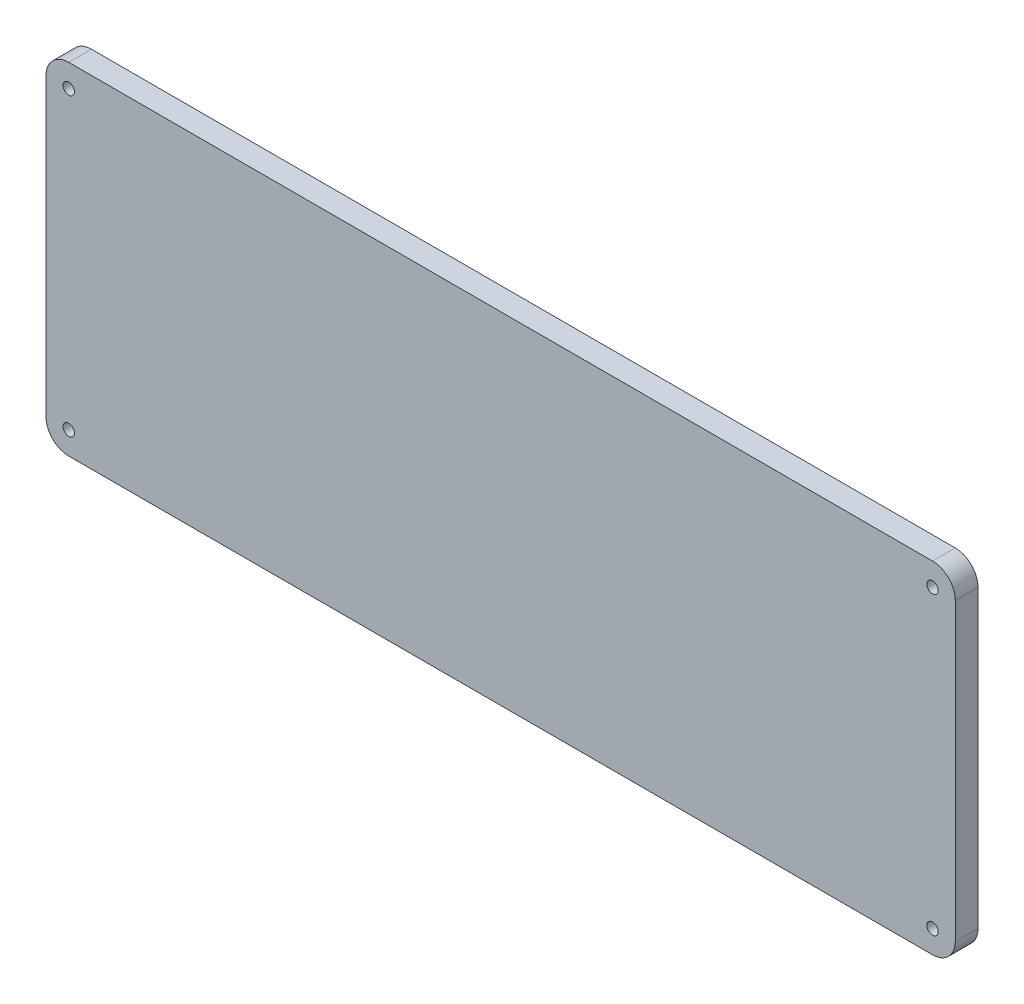
ISO-10303-21;
HEADER;
FILE_DESCRIPTION(('STEP AP214'),'2;1');
FILE_NAME('part.step','',(''),(''),'','','');
FILE_SCHEMA(('AUTOMOTIVE_DESIGN { 1 0 10303 214 1 1 1 1 }'));
ENDSEC;
DATA;
#1=APPLICATION_CONTEXT('core data for automotive mechanical design processes');
#2=APPLICATION_PROTOCOL_DEFINITION('international standard','automotive_design',2000,#1);
#3=PRODUCT_CONTEXT('',#1,'mechanical');
#4=PRODUCT('Part','Part','',(#3));
#5=PRODUCT_RELATED_PRODUCT_CATEGORY('part','',(#4));
#6=PRODUCT_DEFINITION_FORMATION('','',#4);
#7=PRODUCT_DEFINITION_CONTEXT('part definition',#1,'design');
#8=PRODUCT_DEFINITION('design','',#6,#7);
#9=PRODUCT_DEFINITION_SHAPE('','',#8);
#10=(LENGTH_UNIT() NAMED_UNIT(*) SI_UNIT(.MILLI.,.METRE.));
#11=(NAMED_UNIT(*) PLANE_ANGLE_UNIT() SI_UNIT($,.RADIAN.));
#12=(NAMED_UNIT(*) SI_UNIT($,.STERADIAN.) SOLID_ANGLE_UNIT());
#13=UNCERTAINTY_MEASURE_WITH_UNIT(LENGTH_MEASURE(1.E-05),#10,'distance_accuracy_value','');
#14=(GEOMETRIC_REPRESENTATION_CONTEXT(3) GLOBAL_UNCERTAINTY_ASSIGNED_CONTEXT((#13)) GLOBAL_UNIT_ASSIGNED_CONTEXT((#10,
#11,#12)) REPRESENTATION_CONTEXT('',''));
#15=CARTESIAN_POINT('',(0.,0.,0.));
#16=DIRECTION('',(0.,0.,1.));
#17=DIRECTION('',(1.,0.,0.));
#18=AXIS2_PLACEMENT_3D('',#15,#16,#17);
#19=CARTESIAN_POINT('',(-190.,-65.,10.));
#20=DIRECTION('',(0.,0.,-1.));
#21=DIRECTION('',(-1.,0.,0.));
#22=AXIS2_PLACEMENT_3D('',#19,#20,#21);
#23=PLANE('',#22);
#24=CARTESIAN_POINT('',(-190.,-65.,10.));
#25=DIRECTION('',(0.,0.,1.));
#26=DIRECTION('',(-1.,0.,0.));
#27=AXIS2_PLACEMENT_3D('',#24,#25,#26);
#28=CIRCLE('',#27,10.);
#29=CARTESIAN_POINT('',(-200.,-65.,10.));
#30=VERTEX_POINT('',#29);
#31=CARTESIAN_POINT('',(-190.,-75.,10.));
#32=VERTEX_POINT('',#31);
#33=EDGE_CURVE('E149',#30,#32,#28,.T.);
#34=ORIENTED_EDGE('',*,*,#33,.T.);
#35=DIRECTION('',(1.,0.,0.));
#36=VECTOR('',#35,1.);
#37=CARTESIAN_POINT('',(-190.,-75.,10.));
#38=LINE('',#37,#36);
#39=CARTESIAN_POINT('',(190.,-75.,10.));
#40=VERTEX_POINT('',#39);
#41=EDGE_CURVE('E97',#32,#40,#38,.T.);
#42=ORIENTED_EDGE('',*,*,#41,.T.);
#43=CARTESIAN_POINT('',(190.,-64.9999999999999,10.));
#44=DIRECTION('',(0.,0.,1.));
#45=DIRECTION('',(1.,0.,0.));
#46=AXIS2_PLACEMENT_3D('',#43,#44,#45);
#47=CIRCLE('',#46,10.);
#48=CARTESIAN_POINT('',(200.,-64.9999999999999,10.));
#49=VERTEX_POINT('',#48);
#50=EDGE_CURVE('E164',#40,#49,#47,.T.);
#51=ORIENTED_EDGE('',*,*,#50,.T.);
#52=DIRECTION('',(0.,1.,0.));
#53=VECTOR('',#52,1.);
#54=CARTESIAN_POINT('',(200.,-65.,10.));
#55=LINE('',#54,#53);
#56=CARTESIAN_POINT('',(200.,65.,10.));
#57=VERTEX_POINT('',#56);
#58=EDGE_CURVE('E177',#49,#57,#55,.T.);
#59=ORIENTED_EDGE('',*,*,#58,.T.);
#60=CARTESIAN_POINT('',(190.,64.9999999999999,10.));
#61=DIRECTION('',(0.,0.,1.));
#62=DIRECTION('',(-1.,0.,0.));
#63=AXIS2_PLACEMENT_3D('',#60,#61,#62);
#64=CIRCLE('',#63,10.);
#65=CARTESIAN_POINT('',(190.,75.,10.));
#66=VERTEX_POINT('',#65);
#67=EDGE_CURVE('E116',#57,#66,#64,.T.);
#68=ORIENTED_EDGE('',*,*,#67,.T.);
#69=DIRECTION('',(-1.,0.,0.));
#70=VECTOR('',#69,1.);
#71=CARTESIAN_POINT('',(-190.,75.,10.));
#72=LINE('',#71,#70);
#73=CARTESIAN_POINT('',(-190.,75.,10.));
#74=VERTEX_POINT('',#73);
#75=EDGE_CURVE('E110',#66,#74,#72,.T.);
#76=ORIENTED_EDGE('',*,*,#75,.T.);
#77=CARTESIAN_POINT('',(-190.,64.9999999999999,10.));
#78=DIRECTION('',(0.,0.,1.));
#79=DIRECTION('',(-1.,0.,0.));
#80=AXIS2_PLACEMENT_3D('',#77,#78,#79);
#81=CIRCLE('',#80,10.);
#82=CARTESIAN_POINT('',(-200.,65.,10.));
#83=VERTEX_POINT('',#82);
#84=EDGE_CURVE('E114',#74,#83,#81,.T.);
#85=ORIENTED_EDGE('',*,*,#84,.T.);
#86=DIRECTION('',(0.,-1.,0.));
#87=VECTOR('',#86,1.);
#88=CARTESIAN_POINT('',(-200.,-65.,10.));
#89=LINE('',#88,#87);
#90=EDGE_CURVE('E54',#83,#30,#89,.T.);
#91=ORIENTED_EDGE('',*,*,#90,.T.);
#92=EDGE_LOOP('',(#34,#42,#51,#59,#68,#76,#85,#91));
#93=FACE_BOUND('',#92,.T.);
#94=CARTESIAN_POINT('',(-190.,64.9999999999999,10.));
#95=DIRECTION('',(0.,0.,1.));
#96=DIRECTION('',(1.,0.,0.));
#97=AXIS2_PLACEMENT_3D('',#94,#95,#96);
#98=CIRCLE('',#97,2.5);
#99=CARTESIAN_POINT('',(-187.5,64.9999999999999,10.));
#100=VERTEX_POINT('',#99);
#101=EDGE_CURVE('E138',#100,#100,#98,.T.);
#102=ORIENTED_EDGE('',*,*,#101,.F.);
#103=EDGE_LOOP('',(#102));
#104=FACE_BOUND('',#103,.T.);
#105=CARTESIAN_POINT('',(-190.,-65.,10.));
#106=DIRECTION('',(0.,0.,1.));
#107=DIRECTION('',(-1.,0.,0.));
#108=AXIS2_PLACEMENT_3D('',#105,#106,#107);
#109=CIRCLE('',#108,2.5);
#110=CARTESIAN_POINT('',(-192.5,-65.,10.));
#111=VERTEX_POINT('',#110);
#112=EDGE_CURVE('E186',#111,#111,#109,.T.);
#113=ORIENTED_EDGE('',*,*,#112,.F.);
#114=EDGE_LOOP('',(#113));
#115=FACE_BOUND('',#114,.T.);
#116=CARTESIAN_POINT('',(190.,-64.9999999999999,10.));
#117=DIRECTION('',(0.,0.,1.));
#118=DIRECTION('',(1.,0.,0.));
#119=AXIS2_PLACEMENT_3D('',#116,#117,#118);
#120=CIRCLE('',#119,2.50000000000005);
#121=CARTESIAN_POINT('',(192.5,-64.9999999999999,10.));
#122=VERTEX_POINT('',#121);
#123=EDGE_CURVE('E192',#122,#122,#120,.T.);
#124=ORIENTED_EDGE('',*,*,#123,.F.);
#125=EDGE_LOOP('',(#124));
#126=FACE_BOUND('',#125,.T.);
#127=CARTESIAN_POINT('',(190.,64.9999999999999,10.));
#128=DIRECTION('',(0.,0.,1.));
#129=DIRECTION('',(-1.,0.,0.));
#130=AXIS2_PLACEMENT_3D('',#127,#128,#129);
#131=CIRCLE('',#130,2.50000000000005);
#132=CARTESIAN_POINT('',(187.5,64.9999999999999,10.));
#133=VERTEX_POINT('',#132);
#134=EDGE_CURVE('E198',#133,#133,#131,.T.);
#135=ORIENTED_EDGE('',*,*,#134,.F.);
#136=EDGE_LOOP('',(#135));
#137=FACE_BOUND('',#136,.T.);
#138=ADVANCED_FACE('F37',(#93,#104,#115,#126,#137),#23,.F.);
#139=CARTESIAN_POINT('',(-190.,-65.,0.));
#140=DIRECTION('',(0.,0.,-1.));
#141=DIRECTION('',(-1.,0.,0.));
#142=AXIS2_PLACEMENT_3D('',#139,#140,#141);
#143=PLANE('',#142);
#144=CARTESIAN_POINT('',(190.,-64.9999999999999,0.));
#145=DIRECTION('',(0.,0.,1.));
#146=DIRECTION('',(1.,0.,0.));
#147=AXIS2_PLACEMENT_3D('',#144,#145,#146);
#148=CIRCLE('',#147,2.50000000000005);
#149=CARTESIAN_POINT('',(192.5,-64.9999999999999,0.));
#150=VERTEX_POINT('',#149);
#151=EDGE_CURVE('E195',#150,#150,#148,.T.);
#152=ORIENTED_EDGE('',*,*,#151,.T.);
#153=EDGE_LOOP('',(#152));
#154=FACE_BOUND('',#153,.T.);
#155=CARTESIAN_POINT('',(-190.,64.9999999999999,0.));
#156=DIRECTION('',(0.,0.,1.));
#157=DIRECTION('',(1.,0.,0.));
#158=AXIS2_PLACEMENT_3D('',#155,#156,#157);
#159=CIRCLE('',#158,2.5);
#160=CARTESIAN_POINT('',(-187.5,64.9999999999999,0.));
#161=VERTEX_POINT('',#160);
#162=EDGE_CURVE('E183',#161,#161,#159,.T.);
#163=ORIENTED_EDGE('',*,*,#162,.T.);
#164=EDGE_LOOP('',(#163));
#165=FACE_BOUND('',#164,.T.);
#166=CARTESIAN_POINT('',(-190.,-65.,0.));
#167=DIRECTION('',(0.,0.,1.));
#168=DIRECTION('',(-1.,0.,0.));
#169=AXIS2_PLACEMENT_3D('',#166,#167,#168);
#170=CIRCLE('',#169,10.);
#171=CARTESIAN_POINT('',(-200.,-65.,0.));
#172=VERTEX_POINT('',#171);
#173=CARTESIAN_POINT('',(-190.,-75.,0.));
#174=VERTEX_POINT('',#173);
#175=EDGE_CURVE('E134',#172,#174,#170,.T.);
#176=ORIENTED_EDGE('',*,*,#175,.F.);
#177=DIRECTION('',(0.,-1.,0.));
#178=VECTOR('',#177,1.);
#179=CARTESIAN_POINT('',(-200.,-65.,0.));
#180=LINE('',#179,#178);
#181=CARTESIAN_POINT('',(-200.,65.,0.));
#182=VERTEX_POINT('',#181);
#183=EDGE_CURVE('E89',#182,#172,#180,.T.);
#184=ORIENTED_EDGE('',*,*,#183,.F.);
#185=CARTESIAN_POINT('',(-190.,64.9999999999999,0.));
#186=DIRECTION('',(0.,0.,1.));
#187=DIRECTION('',(-1.,0.,0.));
#188=AXIS2_PLACEMENT_3D('',#185,#186,#187);
#189=CIRCLE('',#188,10.);
#190=CARTESIAN_POINT('',(-190.,75.,0.));
#191=VERTEX_POINT('',#190);
#192=EDGE_CURVE('E83',#191,#182,#189,.T.);
#193=ORIENTED_EDGE('',*,*,#192,.F.);
#194=DIRECTION('',(-1.,0.,0.));
#195=VECTOR('',#194,1.);
#196=CARTESIAN_POINT('',(-190.,75.,0.));
#197=LINE('',#196,#195);
#198=CARTESIAN_POINT('',(190.,75.,0.));
#199=VERTEX_POINT('',#198);
#200=EDGE_CURVE('E124',#199,#191,#197,.T.);
#201=ORIENTED_EDGE('',*,*,#200,.F.);
#202=CARTESIAN_POINT('',(190.,64.9999999999999,0.));
#203=DIRECTION('',(0.,0.,1.));
#204=DIRECTION('',(-1.,0.,0.));
#205=AXIS2_PLACEMENT_3D('',#202,#203,#204);
#206=CIRCLE('',#205,10.);
#207=CARTESIAN_POINT('',(200.,65.,0.));
#208=VERTEX_POINT('',#207);
#209=EDGE_CURVE('E144',#208,#199,#206,.T.);
#210=ORIENTED_EDGE('',*,*,#209,.F.);
#211=DIRECTION('',(0.,1.,0.));
#212=VECTOR('',#211,1.);
#213=CARTESIAN_POINT('',(200.,-65.,0.));
#214=LINE('',#213,#212);
#215=CARTESIAN_POINT('',(200.,-64.9999999999999,0.));
#216=VERTEX_POINT('',#215);
#217=EDGE_CURVE('E142',#216,#208,#214,.T.);
#218=ORIENTED_EDGE('',*,*,#217,.F.);
#219=CARTESIAN_POINT('',(190.,-64.9999999999999,0.));
#220=DIRECTION('',(0.,0.,1.));
#221=DIRECTION('',(1.,0.,0.));
#222=AXIS2_PLACEMENT_3D('',#219,#220,#221);
#223=CIRCLE('',#222,10.);
#224=CARTESIAN_POINT('',(190.,-75.,0.));
#225=VERTEX_POINT('',#224);
#226=EDGE_CURVE('E140',#225,#216,#223,.T.);
#227=ORIENTED_EDGE('',*,*,#226,.F.);
#228=DIRECTION('',(1.,0.,0.));
#229=VECTOR('',#228,1.);
#230=CARTESIAN_POINT('',(-190.,-75.,0.));
#231=LINE('',#230,#229);
#232=EDGE_CURVE('E137',#174,#225,#231,.T.);
#233=ORIENTED_EDGE('',*,*,#232,.F.);
#234=EDGE_LOOP('',(#176,#184,#193,#201,#210,#218,#227,#233));
#235=FACE_BOUND('',#234,.T.);
#236=CARTESIAN_POINT('',(-190.,-65.,0.));
#237=DIRECTION('',(0.,0.,1.));
#238=DIRECTION('',(-1.,0.,0.));
#239=AXIS2_PLACEMENT_3D('',#236,#237,#238);
#240=CIRCLE('',#239,2.5);
#241=CARTESIAN_POINT('',(-192.5,-65.,0.));
#242=VERTEX_POINT('',#241);
#243=EDGE_CURVE('E189',#242,#242,#240,.T.);
#244=ORIENTED_EDGE('',*,*,#243,.T.);
#245=EDGE_LOOP('',(#244));
#246=FACE_BOUND('',#245,.T.);
#247=CARTESIAN_POINT('',(190.,64.9999999999999,0.));
#248=DIRECTION('',(0.,0.,1.));
#249=DIRECTION('',(-1.,0.,0.));
#250=AXIS2_PLACEMENT_3D('',#247,#248,#249);
#251=CIRCLE('',#250,2.50000000000005);
#252=CARTESIAN_POINT('',(187.5,64.9999999999999,0.));
#253=VERTEX_POINT('',#252);
#254=EDGE_CURVE('E201',#253,#253,#251,.T.);
#255=ORIENTED_EDGE('',*,*,#254,.T.);
#256=EDGE_LOOP('',(#255));
#257=FACE_BOUND('',#256,.T.);
#258=ADVANCED_FACE('F168',(#154,#165,#235,#246,#257),#143,.T.);
#259=CARTESIAN_POINT('',(-190.,-65.,10.));
#260=DIRECTION('',(0.,0.,-1.));
#261=DIRECTION('',(-1.,0.,0.));
#262=AXIS2_PLACEMENT_3D('',#259,#260,#261);
#263=CYLINDRICAL_SURFACE('',#262,10.);
#264=ORIENTED_EDGE('',*,*,#175,.T.);
#265=DIRECTION('',(0.,0.,-1.));
#266=VECTOR('',#265,1.);
#267=CARTESIAN_POINT('',(-190.,-75.,10.));
#268=LINE('',#267,#266);
#269=EDGE_CURVE('E11',#32,#174,#268,.T.);
#270=ORIENTED_EDGE('',*,*,#269,.F.);
#271=ORIENTED_EDGE('',*,*,#33,.F.);
#272=DIRECTION('',(0.,0.,-1.));
#273=VECTOR('',#272,1.);
#274=CARTESIAN_POINT('',(-200.,-65.,10.));
#275=LINE('',#274,#273);
#276=EDGE_CURVE('E130',#30,#172,#275,.T.);
#277=ORIENTED_EDGE('',*,*,#276,.T.);
#278=EDGE_LOOP('',(#264,#270,#271,#277));
#279=FACE_BOUND('',#278,.T.);
#280=ADVANCED_FACE('F39',(#279),#263,.T.);
#281=CARTESIAN_POINT('',(-190.,-75.,10.));
#282=DIRECTION('',(0.,1.,0.));
#283=DIRECTION('',(0.,0.,1.));
#284=AXIS2_PLACEMENT_3D('',#281,#282,#283);
#285=PLANE('',#284);
#286=ORIENTED_EDGE('',*,*,#232,.T.);
#287=DIRECTION('',(0.,0.,-1.));
#288=VECTOR('',#287,1.);
#289=CARTESIAN_POINT('',(190.,-75.,10.));
#290=LINE('',#289,#288);
#291=EDGE_CURVE('E46',#40,#225,#290,.T.);
#292=ORIENTED_EDGE('',*,*,#291,.F.);
#293=ORIENTED_EDGE('',*,*,#41,.F.);
#294=ORIENTED_EDGE('',*,*,#269,.T.);
#295=EDGE_LOOP('',(#286,#292,#293,#294));
#296=FACE_BOUND('',#295,.T.);
#297=ADVANCED_FACE('F233',(#296),#285,.F.);
#298=CARTESIAN_POINT('',(190.,-64.9999999999999,10.));
#299=DIRECTION('',(0.,0.,-1.));
#300=DIRECTION('',(-1.,0.,0.));
#301=AXIS2_PLACEMENT_3D('',#298,#299,#300);
#302=CYLINDRICAL_SURFACE('',#301,10.);
#303=ORIENTED_EDGE('',*,*,#226,.T.);
#304=DIRECTION('',(0.,0.,-1.));
#305=VECTOR('',#304,1.);
#306=CARTESIAN_POINT('',(200.,-64.9999999999999,10.));
#307=LINE('',#306,#305);
#308=EDGE_CURVE('E156',#49,#216,#307,.T.);
#309=ORIENTED_EDGE('',*,*,#308,.F.);
#310=ORIENTED_EDGE('',*,*,#50,.F.);
#311=ORIENTED_EDGE('',*,*,#291,.T.);
#312=EDGE_LOOP('',(#303,#309,#310,#311));
#313=FACE_BOUND('',#312,.T.);
#314=ADVANCED_FACE('F162',(#313),#302,.T.);
#315=CARTESIAN_POINT('',(200.,-65.,10.));
#316=DIRECTION('',(-1.,0.,0.));
#317=DIRECTION('',(0.,-1.,0.));
#318=AXIS2_PLACEMENT_3D('',#315,#316,#317);
#319=PLANE('',#318);
#320=ORIENTED_EDGE('',*,*,#217,.T.);
#321=DIRECTION('',(0.,0.,-1.));
#322=VECTOR('',#321,1.);
#323=CARTESIAN_POINT('',(200.,65.,10.));
#324=LINE('',#323,#322);
#325=EDGE_CURVE('E153',#57,#208,#324,.T.);
#326=ORIENTED_EDGE('',*,*,#325,.F.);
#327=ORIENTED_EDGE('',*,*,#58,.F.);
#328=ORIENTED_EDGE('',*,*,#308,.T.);
#329=EDGE_LOOP('',(#320,#326,#327,#328));
#330=FACE_BOUND('',#329,.T.);
#331=ADVANCED_FACE('F173',(#330),#319,.F.);
#332=CARTESIAN_POINT('',(190.,64.9999999999999,10.));
#333=DIRECTION('',(0.,0.,-1.));
#334=DIRECTION('',(-1.,0.,0.));
#335=AXIS2_PLACEMENT_3D('',#332,#333,#334);
#336=CYLINDRICAL_SURFACE('',#335,10.);
#337=ORIENTED_EDGE('',*,*,#209,.T.);
#338=DIRECTION('',(0.,0.,-1.));
#339=VECTOR('',#338,1.);
#340=CARTESIAN_POINT('',(190.,75.,10.));
#341=LINE('',#340,#339);
#342=EDGE_CURVE('E125',#66,#199,#341,.T.);
#343=ORIENTED_EDGE('',*,*,#342,.F.);
#344=ORIENTED_EDGE('',*,*,#67,.F.);
#345=ORIENTED_EDGE('',*,*,#325,.T.);
#346=EDGE_LOOP('',(#337,#343,#344,#345));
#347=FACE_BOUND('',#346,.T.);
#348=ADVANCED_FACE('F176',(#347),#336,.T.);
#349=CARTESIAN_POINT('',(-190.,75.,10.));
#350=DIRECTION('',(0.,-1.,0.));
#351=DIRECTION('',(0.,0.,-1.));
#352=AXIS2_PLACEMENT_3D('',#349,#350,#351);
#353=PLANE('',#352);
#354=ORIENTED_EDGE('',*,*,#200,.T.);
#355=DIRECTION('',(0.,0.,-1.));
#356=VECTOR('',#355,1.);
#357=CARTESIAN_POINT('',(-190.,75.,10.));
#358=LINE('',#357,#356);
#359=EDGE_CURVE('E121',#74,#191,#358,.T.);
#360=ORIENTED_EDGE('',*,*,#359,.F.);
#361=ORIENTED_EDGE('',*,*,#75,.F.);
#362=ORIENTED_EDGE('',*,*,#342,.T.);
#363=EDGE_LOOP('',(#354,#360,#361,#362));
#364=FACE_BOUND('',#363,.T.);
#365=ADVANCED_FACE('F122',(#364),#353,.F.);
#366=CARTESIAN_POINT('',(-190.,64.9999999999999,10.));
#367=DIRECTION('',(0.,0.,-1.));
#368=DIRECTION('',(-1.,0.,0.));
#369=AXIS2_PLACEMENT_3D('',#366,#367,#368);
#370=CYLINDRICAL_SURFACE('',#369,10.);
#371=ORIENTED_EDGE('',*,*,#192,.T.);
#372=DIRECTION('',(0.,0.,-1.));
#373=VECTOR('',#372,1.);
#374=CARTESIAN_POINT('',(-200.,65.,10.));
#375=LINE('',#374,#373);
#376=EDGE_CURVE('E126',#83,#182,#375,.T.);
#377=ORIENTED_EDGE('',*,*,#376,.F.);
#378=ORIENTED_EDGE('',*,*,#84,.F.);
#379=ORIENTED_EDGE('',*,*,#359,.T.);
#380=EDGE_LOOP('',(#371,#377,#378,#379));
#381=FACE_BOUND('',#380,.T.);
#382=ADVANCED_FACE('F128',(#381),#370,.T.);
#383=CARTESIAN_POINT('',(-200.,-65.,10.));
#384=DIRECTION('',(1.,0.,0.));
#385=DIRECTION('',(0.,1.,0.));
#386=AXIS2_PLACEMENT_3D('',#383,#384,#385);
#387=PLANE('',#386);
#388=ORIENTED_EDGE('',*,*,#183,.T.);
#389=ORIENTED_EDGE('',*,*,#276,.F.);
#390=ORIENTED_EDGE('',*,*,#90,.F.);
#391=ORIENTED_EDGE('',*,*,#376,.T.);
#392=EDGE_LOOP('',(#388,#389,#390,#391));
#393=FACE_BOUND('',#392,.T.);
#394=ADVANCED_FACE('F221',(#393),#387,.F.);
#395=CARTESIAN_POINT('',(-190.,64.9999999999999,10.));
#396=DIRECTION('',(0.,0.,-1.));
#397=DIRECTION('',(-1.,0.,0.));
#398=AXIS2_PLACEMENT_3D('',#395,#396,#397);
#399=CYLINDRICAL_SURFACE('',#398,2.5);
#400=ORIENTED_EDGE('',*,*,#101,.T.);
#401=EDGE_LOOP('',(#400));
#402=FACE_BOUND('',#401,.T.);
#403=ORIENTED_EDGE('',*,*,#162,.F.);
#404=EDGE_LOOP('',(#403));
#405=FACE_BOUND('',#404,.T.);
#406=ADVANCED_FACE('F218',(#402,#405),#399,.F.);
#407=CARTESIAN_POINT('',(-190.,-65.,10.));
#408=DIRECTION('',(0.,0.,-1.));
#409=DIRECTION('',(-1.,0.,0.));
#410=AXIS2_PLACEMENT_3D('',#407,#408,#409);
#411=CYLINDRICAL_SURFACE('',#410,2.5);
#412=ORIENTED_EDGE('',*,*,#112,.T.);
#413=EDGE_LOOP('',(#412));
#414=FACE_BOUND('',#413,.T.);
#415=ORIENTED_EDGE('',*,*,#243,.F.);
#416=EDGE_LOOP('',(#415));
#417=FACE_BOUND('',#416,.T.);
#418=ADVANCED_FACE('F297',(#414,#417),#411,.F.);
#419=CARTESIAN_POINT('',(190.,-64.9999999999999,10.));
#420=DIRECTION('',(0.,0.,-1.));
#421=DIRECTION('',(-1.,0.,0.));
#422=AXIS2_PLACEMENT_3D('',#419,#420,#421);
#423=CYLINDRICAL_SURFACE('',#422,2.50000000000005);
#424=ORIENTED_EDGE('',*,*,#123,.T.);
#425=EDGE_LOOP('',(#424));
#426=FACE_BOUND('',#425,.T.);
#427=ORIENTED_EDGE('',*,*,#151,.F.);
#428=EDGE_LOOP('',(#427));
#429=FACE_BOUND('',#428,.T.);
#430=ADVANCED_FACE('F305',(#426,#429),#423,.F.);
#431=CARTESIAN_POINT('',(190.,64.9999999999999,10.));
#432=DIRECTION('',(0.,0.,-1.));
#433=DIRECTION('',(-1.,0.,0.));
#434=AXIS2_PLACEMENT_3D('',#431,#432,#433);
#435=CYLINDRICAL_SURFACE('',#434,2.50000000000005);
#436=ORIENTED_EDGE('',*,*,#134,.T.);
#437=EDGE_LOOP('',(#436));
#438=FACE_BOUND('',#437,.T.);
#439=ORIENTED_EDGE('',*,*,#254,.F.);
#440=EDGE_LOOP('',(#439));
#441=FACE_BOUND('',#440,.T.);
#442=ADVANCED_FACE('F207',(#438,#441),#435,.F.);
#443=CLOSED_SHELL('',(#138,#258,#280,#297,#314,#331,#348,#365,#382,#394,#406,#418,#430,#442));
#444=MANIFOLD_SOLID_BREP('B2',#443);
#445=ADVANCED_BREP_SHAPE_REPRESENTATION('',(#18,#444),#14);
#446=SHAPE_DEFINITION_REPRESENTATION(#9,#445);
ENDSEC;
END-ISO-10303-21;
